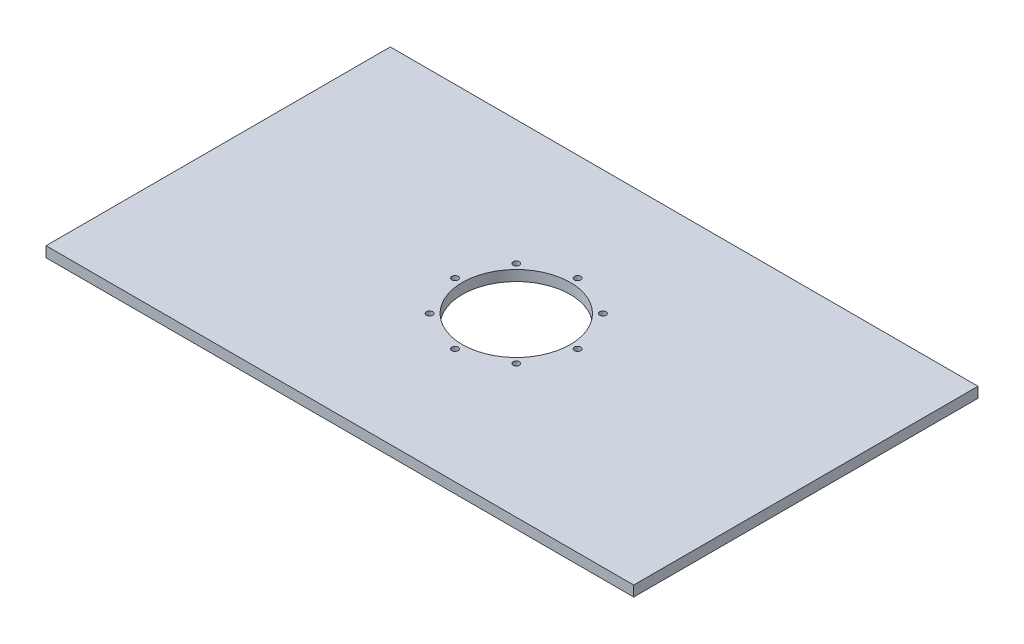
ISO-10303-21;
HEADER;
FILE_DESCRIPTION(('STEP AP214'),'2;1');
FILE_NAME('part.step','',(''),(''),'','','');
FILE_SCHEMA(('AUTOMOTIVE_DESIGN { 1 0 10303 214 1 1 1 1 }'));
ENDSEC;
DATA;
#1=APPLICATION_CONTEXT('core data for automotive mechanical design processes');
#2=APPLICATION_PROTOCOL_DEFINITION('international standard','automotive_design',2000,#1);
#3=PRODUCT_CONTEXT('',#1,'mechanical');
#4=PRODUCT('Part','Part','',(#3));
#5=PRODUCT_RELATED_PRODUCT_CATEGORY('part','',(#4));
#6=PRODUCT_DEFINITION_FORMATION('','',#4);
#7=PRODUCT_DEFINITION_CONTEXT('part definition',#1,'design');
#8=PRODUCT_DEFINITION('design','',#6,#7);
#9=PRODUCT_DEFINITION_SHAPE('','',#8);
#10=(LENGTH_UNIT() NAMED_UNIT(*) SI_UNIT(.MILLI.,.METRE.));
#11=(NAMED_UNIT(*) PLANE_ANGLE_UNIT() SI_UNIT($,.RADIAN.));
#12=(NAMED_UNIT(*) SI_UNIT($,.STERADIAN.) SOLID_ANGLE_UNIT());
#13=UNCERTAINTY_MEASURE_WITH_UNIT(LENGTH_MEASURE(1.E-05),#10,'distance_accuracy_value','');
#14=(GEOMETRIC_REPRESENTATION_CONTEXT(3) GLOBAL_UNCERTAINTY_ASSIGNED_CONTEXT((#13)) GLOBAL_UNIT_ASSIGNED_CONTEXT((#10,
#11,#12)) REPRESENTATION_CONTEXT('',''));
#15=CARTESIAN_POINT('',(0.,0.,0.));
#16=DIRECTION('',(0.,0.,1.));
#17=DIRECTION('',(1.,0.,0.));
#18=AXIS2_PLACEMENT_3D('',#15,#16,#17);
#19=CARTESIAN_POINT('',(0.,3.,0.));
#20=DIRECTION('',(0.,1.,0.));
#21=DIRECTION('',(0.,0.,1.));
#22=AXIS2_PLACEMENT_3D('',#19,#20,#21);
#23=PLANE('',#22);
#24=CARTESIAN_POINT('',(66.8750000000002,3.,-50.7318670248405));
#25=DIRECTION('',(0.,1.,0.));
#26=DIRECTION('',(0.,0.,1.));
#27=AXIS2_PLACEMENT_3D('',#24,#25,#26);
#28=CIRCLE('',#27,0.90500000000001);
#29=CARTESIAN_POINT('',(66.8750000000002,3.,-49.8268670248405));
#30=VERTEX_POINT('',#29);
#31=EDGE_CURVE('E362',#30,#30,#28,.T.);
#32=ORIENTED_EDGE('',*,*,#31,.F.);
#33=EDGE_LOOP('',(#32));
#34=FACE_BOUND('',#33,.T.);
#35=CARTESIAN_POINT('',(84.5,3.,-68.3568670248405));
#36=DIRECTION('',(0.,1.,0.));
#37=DIRECTION('',(0.,0.,1.));
#38=AXIS2_PLACEMENT_3D('',#35,#36,#37);
#39=CIRCLE('',#38,0.90500000000001);
#40=CARTESIAN_POINT('',(84.5,3.,-67.4518670248405));
#41=VERTEX_POINT('',#40);
#42=EDGE_CURVE('E372',#41,#41,#39,.T.);
#43=ORIENTED_EDGE('',*,*,#42,.F.);
#44=EDGE_LOOP('',(#43));
#45=FACE_BOUND('',#44,.T.);
#46=CARTESIAN_POINT('',(102.125,3.,-50.7318670248407));
#47=DIRECTION('',(0.,1.,0.));
#48=DIRECTION('',(0.,0.,1.));
#49=AXIS2_PLACEMENT_3D('',#46,#47,#48);
#50=CIRCLE('',#49,0.90500000000001);
#51=CARTESIAN_POINT('',(102.125,3.,-49.8268670248407));
#52=VERTEX_POINT('',#51);
#53=EDGE_CURVE('E387',#52,#52,#50,.T.);
#54=ORIENTED_EDGE('',*,*,#53,.F.);
#55=EDGE_LOOP('',(#54));
#56=FACE_BOUND('',#55,.T.);
#57=CARTESIAN_POINT('',(84.5000000000004,3.,-33.1068670248405));
#58=DIRECTION('',(0.,1.,0.));
#59=DIRECTION('',(0.,0.,1.));
#60=AXIS2_PLACEMENT_3D('',#57,#58,#59);
#61=CIRCLE('',#60,0.905000000000024);
#62=CARTESIAN_POINT('',(84.5000000000004,3.,-32.2018670248405));
#63=VERTEX_POINT('',#62);
#64=EDGE_CURVE('E400',#63,#63,#61,.T.);
#65=ORIENTED_EDGE('',*,*,#64,.F.);
#66=EDGE_LOOP('',(#65));
#67=FACE_BOUND('',#66,.T.);
#68=DIRECTION('',(1.,0.,0.));
#69=VECTOR('',#68,1.);
#70=CARTESIAN_POINT('',(0.,3.,-99.));
#71=LINE('',#70,#69);
#72=CARTESIAN_POINT('',(0.,3.,-99.));
#73=VERTEX_POINT('',#72);
#74=CARTESIAN_POINT('',(169.,3.,-99.));
#75=VERTEX_POINT('',#74);
#76=EDGE_CURVE('E277',#73,#75,#71,.T.);
#77=ORIENTED_EDGE('',*,*,#76,.F.);
#78=DIRECTION('',(0.,0.,-1.));
#79=VECTOR('',#78,1.);
#80=CARTESIAN_POINT('',(0.,3.,0.));
#81=LINE('',#80,#79);
#82=CARTESIAN_POINT('',(0.,3.,0.));
#83=VERTEX_POINT('',#82);
#84=EDGE_CURVE('E266',#83,#73,#81,.T.);
#85=ORIENTED_EDGE('',*,*,#84,.F.);
#86=DIRECTION('',(1.,0.,0.));
#87=VECTOR('',#86,1.);
#88=CARTESIAN_POINT('',(0.,3.,0.));
#89=LINE('',#88,#87);
#90=CARTESIAN_POINT('',(169.,3.,0.));
#91=VERTEX_POINT('',#90);
#92=EDGE_CURVE('E263',#83,#91,#89,.T.);
#93=ORIENTED_EDGE('',*,*,#92,.T.);
#94=DIRECTION('',(0.,0.,-1.));
#95=VECTOR('',#94,1.);
#96=CARTESIAN_POINT('',(169.,3.,0.));
#97=LINE('',#96,#95);
#98=EDGE_CURVE('E257',#91,#75,#97,.T.);
#99=ORIENTED_EDGE('',*,*,#98,.T.);
#100=EDGE_LOOP('',(#77,#85,#93,#99));
#101=FACE_BOUND('',#100,.T.);
#102=CARTESIAN_POINT('',(84.5,3.,-50.7318670248405));
#103=DIRECTION('',(0.,1.,0.));
#104=DIRECTION('',(0.,0.,1.));
#105=AXIS2_PLACEMENT_3D('',#102,#103,#104);
#106=CIRCLE('',#105,15.5);
#107=CARTESIAN_POINT('',(84.5,3.,-35.2318670248405));
#108=VERTEX_POINT('',#107);
#109=EDGE_CURVE('E286',#108,#108,#106,.T.);
#110=ORIENTED_EDGE('',*,*,#109,.F.);
#111=EDGE_LOOP('',(#110));
#112=FACE_BOUND('',#111,.T.);
#113=CARTESIAN_POINT('',(96.9627570184133,3.,-38.2691100064277));
#114=DIRECTION('',(0.,1.,0.));
#115=DIRECTION('',(0.,0.,1.));
#116=AXIS2_PLACEMENT_3D('',#113,#114,#115);
#117=CIRCLE('',#116,0.905000000000006);
#118=CARTESIAN_POINT('',(96.9627570184133,3.,-37.3641100064277));
#119=VERTEX_POINT('',#118);
#120=EDGE_CURVE('E395',#119,#119,#117,.T.);
#121=ORIENTED_EDGE('',*,*,#120,.F.);
#122=EDGE_LOOP('',(#121));
#123=FACE_BOUND('',#122,.T.);
#124=CARTESIAN_POINT('',(96.962757018413,3.,-63.1946240432536));
#125=DIRECTION('',(0.,1.,0.));
#126=DIRECTION('',(0.,0.,1.));
#127=AXIS2_PLACEMENT_3D('',#124,#125,#126);
#128=CIRCLE('',#127,0.905000000000006);
#129=CARTESIAN_POINT('',(96.962757018413,3.,-62.2896240432536));
#130=VERTEX_POINT('',#129);
#131=EDGE_CURVE('E379',#130,#130,#128,.T.);
#132=ORIENTED_EDGE('',*,*,#131,.F.);
#133=EDGE_LOOP('',(#132));
#134=FACE_BOUND('',#133,.T.);
#135=CARTESIAN_POINT('',(72.0372429815873,3.,-63.1946240432534));
#136=DIRECTION('',(0.,1.,0.));
#137=DIRECTION('',(0.,0.,1.));
#138=AXIS2_PLACEMENT_3D('',#135,#136,#137);
#139=CIRCLE('',#138,0.905000000000006);
#140=CARTESIAN_POINT('',(72.0372429815873,3.,-62.2896240432534));
#141=VERTEX_POINT('',#140);
#142=EDGE_CURVE('E366',#141,#141,#139,.T.);
#143=ORIENTED_EDGE('',*,*,#142,.F.);
#144=EDGE_LOOP('',(#143));
#145=FACE_BOUND('',#144,.T.);
#146=CARTESIAN_POINT('',(72.0372429815874,3.,-38.2691100064275));
#147=DIRECTION('',(0.,1.,0.));
#148=DIRECTION('',(0.,0.,1.));
#149=AXIS2_PLACEMENT_3D('',#146,#147,#148);
#150=CIRCLE('',#149,0.905000000000006);
#151=CARTESIAN_POINT('',(72.0372429815874,3.,-37.3641100064275));
#152=VERTEX_POINT('',#151);
#153=EDGE_CURVE('E354',#152,#152,#150,.T.);
#154=ORIENTED_EDGE('',*,*,#153,.F.);
#155=EDGE_LOOP('',(#154));
#156=FACE_BOUND('',#155,.T.);
#157=ADVANCED_FACE('F220',(#34,#45,#56,#67,#101,#112,#123,#134,#145,#156),#23,.T.);
#158=CARTESIAN_POINT('',(0.,0.,0.));
#159=DIRECTION('',(0.,1.,0.));
#160=DIRECTION('',(0.,0.,1.));
#161=AXIS2_PLACEMENT_3D('',#158,#159,#160);
#162=PLANE('',#161);
#163=DIRECTION('',(1.,0.,0.));
#164=VECTOR('',#163,1.);
#165=CARTESIAN_POINT('',(0.,0.,-99.));
#166=LINE('',#165,#164);
#167=CARTESIAN_POINT('',(0.,0.,-99.));
#168=VERTEX_POINT('',#167);
#169=CARTESIAN_POINT('',(169.,0.,-99.));
#170=VERTEX_POINT('',#169);
#171=EDGE_CURVE('E284',#168,#170,#166,.T.);
#172=ORIENTED_EDGE('',*,*,#171,.T.);
#173=DIRECTION('',(0.,0.,-1.));
#174=VECTOR('',#173,1.);
#175=CARTESIAN_POINT('',(169.,0.,0.));
#176=LINE('',#175,#174);
#177=CARTESIAN_POINT('',(169.,0.,0.));
#178=VERTEX_POINT('',#177);
#179=EDGE_CURVE('E289',#178,#170,#176,.T.);
#180=ORIENTED_EDGE('',*,*,#179,.F.);
#181=DIRECTION('',(1.,0.,0.));
#182=VECTOR('',#181,1.);
#183=CARTESIAN_POINT('',(0.,0.,0.));
#184=LINE('',#183,#182);
#185=CARTESIAN_POINT('',(0.,0.,0.));
#186=VERTEX_POINT('',#185);
#187=EDGE_CURVE('E271',#186,#178,#184,.T.);
#188=ORIENTED_EDGE('',*,*,#187,.F.);
#189=DIRECTION('',(0.,0.,-1.));
#190=VECTOR('',#189,1.);
#191=CARTESIAN_POINT('',(0.,0.,0.));
#192=LINE('',#191,#190);
#193=EDGE_CURVE('E279',#186,#168,#192,.T.);
#194=ORIENTED_EDGE('',*,*,#193,.T.);
#195=EDGE_LOOP('',(#172,#180,#188,#194));
#196=FACE_BOUND('',#195,.T.);
#197=CARTESIAN_POINT('',(84.5,0.,-50.7318670248405));
#198=DIRECTION('',(0.,1.,0.));
#199=DIRECTION('',(0.,0.,1.));
#200=AXIS2_PLACEMENT_3D('',#197,#198,#199);
#201=CIRCLE('',#200,15.5);
#202=CARTESIAN_POINT('',(84.5,0.,-35.2318670248405));
#203=VERTEX_POINT('',#202);
#204=EDGE_CURVE('E402',#203,#203,#201,.T.);
#205=ORIENTED_EDGE('',*,*,#204,.T.);
#206=EDGE_LOOP('',(#205));
#207=FACE_BOUND('',#206,.T.);
#208=CARTESIAN_POINT('',(84.5000000000004,0.,-33.1068670248405));
#209=DIRECTION('',(0.,1.,0.));
#210=DIRECTION('',(0.,0.,1.));
#211=AXIS2_PLACEMENT_3D('',#208,#209,#210);
#212=CIRCLE('',#211,0.905000000000024);
#213=CARTESIAN_POINT('',(84.5000000000004,0.,-32.2018670248405));
#214=VERTEX_POINT('',#213);
#215=EDGE_CURVE('E393',#214,#214,#212,.T.);
#216=ORIENTED_EDGE('',*,*,#215,.T.);
#217=EDGE_LOOP('',(#216));
#218=FACE_BOUND('',#217,.T.);
#219=CARTESIAN_POINT('',(96.9627570184133,0.,-38.2691100064277));
#220=DIRECTION('',(0.,1.,0.));
#221=DIRECTION('',(0.,0.,1.));
#222=AXIS2_PLACEMENT_3D('',#219,#220,#221);
#223=CIRCLE('',#222,0.905000000000006);
#224=CARTESIAN_POINT('',(96.9627570184133,0.,-37.3641100064277));
#225=VERTEX_POINT('',#224);
#226=EDGE_CURVE('E386',#225,#225,#223,.T.);
#227=ORIENTED_EDGE('',*,*,#226,.T.);
#228=EDGE_LOOP('',(#227));
#229=FACE_BOUND('',#228,.T.);
#230=CARTESIAN_POINT('',(102.125,0.,-50.7318670248407));
#231=DIRECTION('',(0.,1.,0.));
#232=DIRECTION('',(0.,0.,1.));
#233=AXIS2_PLACEMENT_3D('',#230,#231,#232);
#234=CIRCLE('',#233,0.90500000000001);
#235=CARTESIAN_POINT('',(102.125,0.,-49.8268670248407));
#236=VERTEX_POINT('',#235);
#237=EDGE_CURVE('E382',#236,#236,#234,.T.);
#238=ORIENTED_EDGE('',*,*,#237,.T.);
#239=EDGE_LOOP('',(#238));
#240=FACE_BOUND('',#239,.T.);
#241=CARTESIAN_POINT('',(96.962757018413,0.,-63.1946240432536));
#242=DIRECTION('',(0.,1.,0.));
#243=DIRECTION('',(0.,0.,1.));
#244=AXIS2_PLACEMENT_3D('',#241,#242,#243);
#245=CIRCLE('',#244,0.905000000000006);
#246=CARTESIAN_POINT('',(96.962757018413,0.,-62.2896240432536));
#247=VERTEX_POINT('',#246);
#248=EDGE_CURVE('E380',#247,#247,#245,.T.);
#249=ORIENTED_EDGE('',*,*,#248,.T.);
#250=EDGE_LOOP('',(#249));
#251=FACE_BOUND('',#250,.T.);
#252=CARTESIAN_POINT('',(84.5,0.,-68.3568670248405));
#253=DIRECTION('',(0.,1.,0.));
#254=DIRECTION('',(0.,0.,1.));
#255=AXIS2_PLACEMENT_3D('',#252,#253,#254);
#256=CIRCLE('',#255,0.90500000000001);
#257=CARTESIAN_POINT('',(84.5,0.,-67.4518670248405));
#258=VERTEX_POINT('',#257);
#259=EDGE_CURVE('E371',#258,#258,#256,.T.);
#260=ORIENTED_EDGE('',*,*,#259,.T.);
#261=EDGE_LOOP('',(#260));
#262=FACE_BOUND('',#261,.T.);
#263=CARTESIAN_POINT('',(72.0372429815873,0.,-63.1946240432534));
#264=DIRECTION('',(0.,1.,0.));
#265=DIRECTION('',(0.,0.,1.));
#266=AXIS2_PLACEMENT_3D('',#263,#264,#265);
#267=CIRCLE('',#266,0.905000000000006);
#268=CARTESIAN_POINT('',(72.0372429815873,0.,-62.2896240432534));
#269=VERTEX_POINT('',#268);
#270=EDGE_CURVE('E364',#269,#269,#267,.T.);
#271=ORIENTED_EDGE('',*,*,#270,.T.);
#272=EDGE_LOOP('',(#271));
#273=FACE_BOUND('',#272,.T.);
#274=CARTESIAN_POINT('',(66.8750000000002,0.,-50.7318670248405));
#275=DIRECTION('',(0.,1.,0.));
#276=DIRECTION('',(0.,0.,1.));
#277=AXIS2_PLACEMENT_3D('',#274,#275,#276);
#278=CIRCLE('',#277,0.90500000000001);
#279=CARTESIAN_POINT('',(66.8750000000002,0.,-49.8268670248405));
#280=VERTEX_POINT('',#279);
#281=EDGE_CURVE('E358',#280,#280,#278,.T.);
#282=ORIENTED_EDGE('',*,*,#281,.T.);
#283=EDGE_LOOP('',(#282));
#284=FACE_BOUND('',#283,.T.);
#285=CARTESIAN_POINT('',(72.0372429815874,0.,-38.2691100064275));
#286=DIRECTION('',(0.,1.,0.));
#287=DIRECTION('',(0.,0.,1.));
#288=AXIS2_PLACEMENT_3D('',#285,#286,#287);
#289=CIRCLE('',#288,0.905000000000006);
#290=CARTESIAN_POINT('',(72.0372429815874,0.,-37.3641100064275));
#291=VERTEX_POINT('',#290);
#292=EDGE_CURVE('E359',#291,#291,#289,.T.);
#293=ORIENTED_EDGE('',*,*,#292,.T.);
#294=EDGE_LOOP('',(#293));
#295=FACE_BOUND('',#294,.T.);
#296=ADVANCED_FACE('F291',(#196,#207,#218,#229,#240,#251,#262,#273,#284,#295),#162,.F.);
#297=CARTESIAN_POINT('',(0.,3.,-99.));
#298=DIRECTION('',(0.,0.,-1.));
#299=DIRECTION('',(-1.,0.,0.));
#300=AXIS2_PLACEMENT_3D('',#297,#298,#299);
#301=PLANE('',#300);
#302=ORIENTED_EDGE('',*,*,#171,.F.);
#303=DIRECTION('',(0.,-1.,0.));
#304=VECTOR('',#303,1.);
#305=CARTESIAN_POINT('',(0.,3.,-99.));
#306=LINE('',#305,#304);
#307=EDGE_CURVE('E12',#73,#168,#306,.T.);
#308=ORIENTED_EDGE('',*,*,#307,.F.);
#309=ORIENTED_EDGE('',*,*,#76,.T.);
#310=DIRECTION('',(0.,-1.,0.));
#311=VECTOR('',#310,1.);
#312=CARTESIAN_POINT('',(169.,3.,-99.));
#313=LINE('',#312,#311);
#314=EDGE_CURVE('E222',#75,#170,#313,.T.);
#315=ORIENTED_EDGE('',*,*,#314,.T.);
#316=EDGE_LOOP('',(#302,#308,#309,#315));
#317=FACE_BOUND('',#316,.T.);
#318=ADVANCED_FACE('F218',(#317),#301,.T.);
#319=CARTESIAN_POINT('',(0.,3.,0.));
#320=DIRECTION('',(-1.,0.,0.));
#321=DIRECTION('',(0.,0.,1.));
#322=AXIS2_PLACEMENT_3D('',#319,#320,#321);
#323=PLANE('',#322);
#324=ORIENTED_EDGE('',*,*,#193,.F.);
#325=DIRECTION('',(0.,-1.,0.));
#326=VECTOR('',#325,1.);
#327=CARTESIAN_POINT('',(0.,3.,0.));
#328=LINE('',#327,#326);
#329=EDGE_CURVE('E230',#83,#186,#328,.T.);
#330=ORIENTED_EDGE('',*,*,#329,.F.);
#331=ORIENTED_EDGE('',*,*,#84,.T.);
#332=ORIENTED_EDGE('',*,*,#307,.T.);
#333=EDGE_LOOP('',(#324,#330,#331,#332));
#334=FACE_BOUND('',#333,.T.);
#335=ADVANCED_FACE('F293',(#334),#323,.T.);
#336=CARTESIAN_POINT('',(0.,3.,0.));
#337=DIRECTION('',(0.,0.,-1.));
#338=DIRECTION('',(-1.,0.,0.));
#339=AXIS2_PLACEMENT_3D('',#336,#337,#338);
#340=PLANE('',#339);
#341=ORIENTED_EDGE('',*,*,#187,.T.);
#342=DIRECTION('',(0.,-1.,0.));
#343=VECTOR('',#342,1.);
#344=CARTESIAN_POINT('',(169.,3.,0.));
#345=LINE('',#344,#343);
#346=EDGE_CURVE('E267',#91,#178,#345,.T.);
#347=ORIENTED_EDGE('',*,*,#346,.F.);
#348=ORIENTED_EDGE('',*,*,#92,.F.);
#349=ORIENTED_EDGE('',*,*,#329,.T.);
#350=EDGE_LOOP('',(#341,#347,#348,#349));
#351=FACE_BOUND('',#350,.T.);
#352=ADVANCED_FACE('F269',(#351),#340,.F.);
#353=CARTESIAN_POINT('',(169.,3.,0.));
#354=DIRECTION('',(-1.,0.,0.));
#355=DIRECTION('',(0.,0.,1.));
#356=AXIS2_PLACEMENT_3D('',#353,#354,#355);
#357=PLANE('',#356);
#358=ORIENTED_EDGE('',*,*,#179,.T.);
#359=ORIENTED_EDGE('',*,*,#314,.F.);
#360=ORIENTED_EDGE('',*,*,#98,.F.);
#361=ORIENTED_EDGE('',*,*,#346,.T.);
#362=EDGE_LOOP('',(#358,#359,#360,#361));
#363=FACE_BOUND('',#362,.T.);
#364=ADVANCED_FACE('F274',(#363),#357,.F.);
#365=CARTESIAN_POINT('',(84.5,3.,-50.7318670248405));
#366=DIRECTION('',(0.,-1.,0.));
#367=DIRECTION('',(0.,0.,-1.));
#368=AXIS2_PLACEMENT_3D('',#365,#366,#367);
#369=CYLINDRICAL_SURFACE('',#368,15.5);
#370=ORIENTED_EDGE('',*,*,#109,.T.);
#371=EDGE_LOOP('',(#370));
#372=FACE_BOUND('',#371,.T.);
#373=ORIENTED_EDGE('',*,*,#204,.F.);
#374=EDGE_LOOP('',(#373));
#375=FACE_BOUND('',#374,.T.);
#376=ADVANCED_FACE('F311',(#372,#375),#369,.F.);
#377=CARTESIAN_POINT('',(84.5000000000004,3.,-33.1068670248405));
#378=DIRECTION('',(0.,-1.,0.));
#379=DIRECTION('',(0.,0.,-1.));
#380=AXIS2_PLACEMENT_3D('',#377,#378,#379);
#381=CYLINDRICAL_SURFACE('',#380,0.905000000000024);
#382=ORIENTED_EDGE('',*,*,#64,.T.);
#383=EDGE_LOOP('',(#382));
#384=FACE_BOUND('',#383,.T.);
#385=ORIENTED_EDGE('',*,*,#215,.F.);
#386=EDGE_LOOP('',(#385));
#387=FACE_BOUND('',#386,.T.);
#388=ADVANCED_FACE('F316',(#384,#387),#381,.F.);
#389=CARTESIAN_POINT('',(96.9627570184133,3.,-38.2691100064277));
#390=DIRECTION('',(0.,-1.,0.));
#391=DIRECTION('',(0.,0.,-1.));
#392=AXIS2_PLACEMENT_3D('',#389,#390,#391);
#393=CYLINDRICAL_SURFACE('',#392,0.905000000000006);
#394=ORIENTED_EDGE('',*,*,#120,.T.);
#395=EDGE_LOOP('',(#394));
#396=FACE_BOUND('',#395,.T.);
#397=ORIENTED_EDGE('',*,*,#226,.F.);
#398=EDGE_LOOP('',(#397));
#399=FACE_BOUND('',#398,.T.);
#400=ADVANCED_FACE('F319',(#396,#399),#393,.F.);
#401=CARTESIAN_POINT('',(102.125,3.,-50.7318670248407));
#402=DIRECTION('',(0.,-1.,0.));
#403=DIRECTION('',(0.,0.,-1.));
#404=AXIS2_PLACEMENT_3D('',#401,#402,#403);
#405=CYLINDRICAL_SURFACE('',#404,0.90500000000001);
#406=ORIENTED_EDGE('',*,*,#53,.T.);
#407=EDGE_LOOP('',(#406));
#408=FACE_BOUND('',#407,.T.);
#409=ORIENTED_EDGE('',*,*,#237,.F.);
#410=EDGE_LOOP('',(#409));
#411=FACE_BOUND('',#410,.T.);
#412=ADVANCED_FACE('F322',(#408,#411),#405,.F.);
#413=CARTESIAN_POINT('',(96.962757018413,3.,-63.1946240432536));
#414=DIRECTION('',(0.,-1.,0.));
#415=DIRECTION('',(0.,0.,-1.));
#416=AXIS2_PLACEMENT_3D('',#413,#414,#415);
#417=CYLINDRICAL_SURFACE('',#416,0.905000000000006);
#418=ORIENTED_EDGE('',*,*,#131,.T.);
#419=EDGE_LOOP('',(#418));
#420=FACE_BOUND('',#419,.T.);
#421=ORIENTED_EDGE('',*,*,#248,.F.);
#422=EDGE_LOOP('',(#421));
#423=FACE_BOUND('',#422,.T.);
#424=ADVANCED_FACE('F327',(#420,#423),#417,.F.);
#425=CARTESIAN_POINT('',(84.5,3.,-68.3568670248405));
#426=DIRECTION('',(0.,-1.,0.));
#427=DIRECTION('',(0.,0.,-1.));
#428=AXIS2_PLACEMENT_3D('',#425,#426,#427);
#429=CYLINDRICAL_SURFACE('',#428,0.90500000000001);
#430=ORIENTED_EDGE('',*,*,#42,.T.);
#431=EDGE_LOOP('',(#430));
#432=FACE_BOUND('',#431,.T.);
#433=ORIENTED_EDGE('',*,*,#259,.F.);
#434=EDGE_LOOP('',(#433));
#435=FACE_BOUND('',#434,.T.);
#436=ADVANCED_FACE('F335',(#432,#435),#429,.F.);
#437=CARTESIAN_POINT('',(72.0372429815873,3.,-63.1946240432534));
#438=DIRECTION('',(0.,-1.,0.));
#439=DIRECTION('',(0.,0.,-1.));
#440=AXIS2_PLACEMENT_3D('',#437,#438,#439);
#441=CYLINDRICAL_SURFACE('',#440,0.905000000000006);
#442=ORIENTED_EDGE('',*,*,#142,.T.);
#443=EDGE_LOOP('',(#442));
#444=FACE_BOUND('',#443,.T.);
#445=ORIENTED_EDGE('',*,*,#270,.F.);
#446=EDGE_LOOP('',(#445));
#447=FACE_BOUND('',#446,.T.);
#448=ADVANCED_FACE('F337',(#444,#447),#441,.F.);
#449=CARTESIAN_POINT('',(66.8750000000002,3.,-50.7318670248405));
#450=DIRECTION('',(0.,-1.,0.));
#451=DIRECTION('',(0.,0.,-1.));
#452=AXIS2_PLACEMENT_3D('',#449,#450,#451);
#453=CYLINDRICAL_SURFACE('',#452,0.90500000000001);
#454=ORIENTED_EDGE('',*,*,#31,.T.);
#455=EDGE_LOOP('',(#454));
#456=FACE_BOUND('',#455,.T.);
#457=ORIENTED_EDGE('',*,*,#281,.F.);
#458=EDGE_LOOP('',(#457));
#459=FACE_BOUND('',#458,.T.);
#460=ADVANCED_FACE('F338',(#456,#459),#453,.F.);
#461=CARTESIAN_POINT('',(72.0372429815874,3.,-38.2691100064275));
#462=DIRECTION('',(0.,-1.,0.));
#463=DIRECTION('',(0.,0.,-1.));
#464=AXIS2_PLACEMENT_3D('',#461,#462,#463);
#465=CYLINDRICAL_SURFACE('',#464,0.905000000000006);
#466=ORIENTED_EDGE('',*,*,#153,.T.);
#467=EDGE_LOOP('',(#466));
#468=FACE_BOUND('',#467,.T.);
#469=ORIENTED_EDGE('',*,*,#292,.F.);
#470=EDGE_LOOP('',(#469));
#471=FACE_BOUND('',#470,.T.);
#472=ADVANCED_FACE('F343',(#468,#471),#465,.F.);
#473=CLOSED_SHELL('',(#157,#296,#318,#335,#352,#364,#376,#388,#400,#412,#424,#436,#448,#460,#472));
#474=MANIFOLD_SOLID_BREP('B2',#473);
#475=ADVANCED_BREP_SHAPE_REPRESENTATION('',(#18,#474),#14);
#476=SHAPE_DEFINITION_REPRESENTATION(#9,#475);
ENDSEC;
END-ISO-10303-21;
